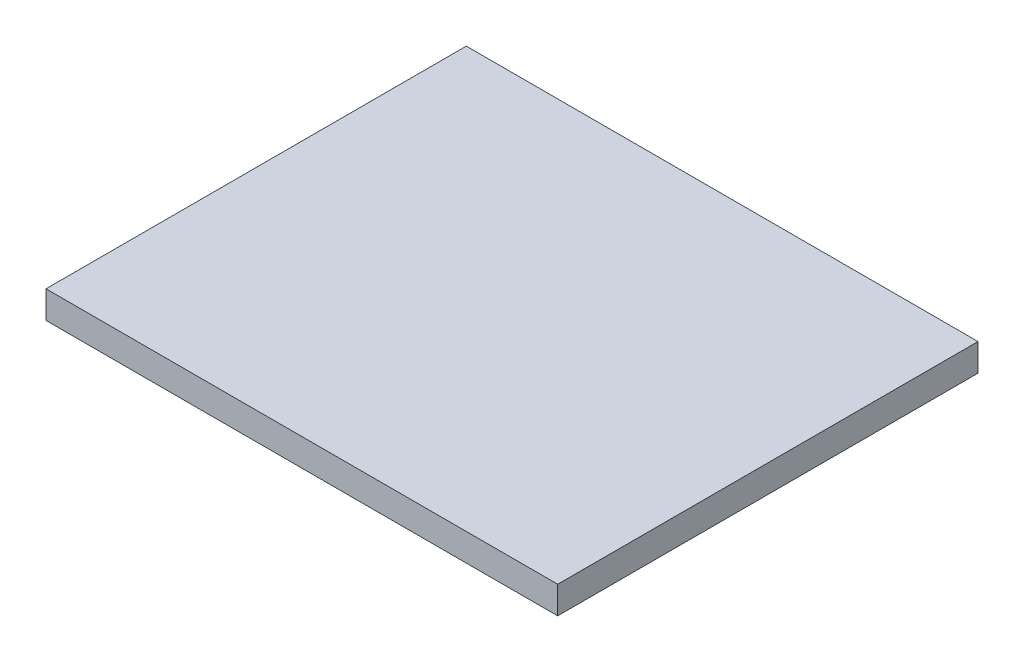
ISO-10303-21;
HEADER;
FILE_DESCRIPTION(('STEP AP214'),'2;1');
FILE_NAME('part.step','',(''),(''),'','','');
FILE_SCHEMA(('AUTOMOTIVE_DESIGN { 1 0 10303 214 1 1 1 1 }'));
ENDSEC;
DATA;
#1=APPLICATION_CONTEXT('core data for automotive mechanical design processes');
#2=APPLICATION_PROTOCOL_DEFINITION('international standard','automotive_design',2000,#1);
#3=PRODUCT_CONTEXT('',#1,'mechanical');
#4=PRODUCT('Part','Part','',(#3));
#5=PRODUCT_RELATED_PRODUCT_CATEGORY('part','',(#4));
#6=PRODUCT_DEFINITION_FORMATION('','',#4);
#7=PRODUCT_DEFINITION_CONTEXT('part definition',#1,'design');
#8=PRODUCT_DEFINITION('design','',#6,#7);
#9=PRODUCT_DEFINITION_SHAPE('','',#8);
#10=(LENGTH_UNIT() NAMED_UNIT(*) SI_UNIT(.MILLI.,.METRE.));
#11=(NAMED_UNIT(*) PLANE_ANGLE_UNIT() SI_UNIT($,.RADIAN.));
#12=(NAMED_UNIT(*) SI_UNIT($,.STERADIAN.) SOLID_ANGLE_UNIT());
#13=UNCERTAINTY_MEASURE_WITH_UNIT(LENGTH_MEASURE(1.E-05),#10,'distance_accuracy_value','');
#14=(GEOMETRIC_REPRESENTATION_CONTEXT(3) GLOBAL_UNCERTAINTY_ASSIGNED_CONTEXT((#13)) GLOBAL_UNIT_ASSIGNED_CONTEXT((#10,
#11,#12)) REPRESENTATION_CONTEXT('',''));
#15=CARTESIAN_POINT('',(0.,0.,0.));
#16=DIRECTION('',(0.,0.,1.));
#17=DIRECTION('',(1.,0.,0.));
#18=AXIS2_PLACEMENT_3D('',#15,#16,#17);
#19=CARTESIAN_POINT('',(0.,0.15,0.));
#20=DIRECTION('',(0.,1.,0.));
#21=DIRECTION('',(0.,0.,1.));
#22=AXIS2_PLACEMENT_3D('',#19,#20,#21);
#23=PLANE('',#22);
#24=DIRECTION('',(-1.,0.,0.));
#25=VECTOR('',#24,1.);
#26=CARTESIAN_POINT('',(1.4,0.15,-1.15));
#27=LINE('',#26,#25);
#28=CARTESIAN_POINT('',(-1.4,0.15,-1.15));
#29=VERTEX_POINT('',#28);
#30=CARTESIAN_POINT('',(1.4,0.15,-1.15));
#31=VERTEX_POINT('',#30);
#32=EDGE_CURVE('E68',#29,#31,#27,.F.);
#33=ORIENTED_EDGE('',*,*,#32,.F.);
#34=DIRECTION('',(0.,0.,1.));
#35=VECTOR('',#34,1.);
#36=CARTESIAN_POINT('',(-1.4,0.15,-1.15));
#37=LINE('',#36,#35);
#38=CARTESIAN_POINT('',(-1.4,0.15,1.15));
#39=VERTEX_POINT('',#38);
#40=EDGE_CURVE('E20',#39,#29,#37,.F.);
#41=ORIENTED_EDGE('',*,*,#40,.F.);
#42=DIRECTION('',(1.,0.,0.));
#43=VECTOR('',#42,1.);
#44=CARTESIAN_POINT('',(-1.4,0.15,1.15));
#45=LINE('',#44,#43);
#46=CARTESIAN_POINT('',(1.4,0.15,1.15));
#47=VERTEX_POINT('',#46);
#48=EDGE_CURVE('E58',#47,#39,#45,.F.);
#49=ORIENTED_EDGE('',*,*,#48,.F.);
#50=DIRECTION('',(0.,0.,-1.));
#51=VECTOR('',#50,1.);
#52=CARTESIAN_POINT('',(1.4,0.15,1.15));
#53=LINE('',#52,#51);
#54=EDGE_CURVE('E53',#31,#47,#53,.F.);
#55=ORIENTED_EDGE('',*,*,#54,.F.);
#56=EDGE_LOOP('',(#33,#41,#49,#55));
#57=FACE_BOUND('',#56,.T.);
#58=ADVANCED_FACE('F17',(#57),#23,.T.);
#59=CARTESIAN_POINT('',(-1.4,0.,-1.15));
#60=DIRECTION('',(-1.,0.,0.));
#61=DIRECTION('',(0.,0.,1.));
#62=AXIS2_PLACEMENT_3D('',#59,#60,#61);
#63=PLANE('',#62);
#64=DIRECTION('',(0.,1.,0.));
#65=VECTOR('',#64,1.);
#66=CARTESIAN_POINT('',(-1.4,0.,-1.15));
#67=LINE('',#66,#65);
#68=CARTESIAN_POINT('',(-1.4,0.,-1.15));
#69=VERTEX_POINT('',#68);
#70=EDGE_CURVE('E79',#69,#29,#67,.T.);
#71=ORIENTED_EDGE('',*,*,#70,.F.);
#72=DIRECTION('',(0.,0.,1.));
#73=VECTOR('',#72,1.);
#74=CARTESIAN_POINT('',(-1.4,0.,0.));
#75=LINE('',#74,#73);
#76=CARTESIAN_POINT('',(-1.4,0.,1.15));
#77=VERTEX_POINT('',#76);
#78=EDGE_CURVE('E74',#69,#77,#75,.T.);
#79=ORIENTED_EDGE('',*,*,#78,.T.);
#80=DIRECTION('',(0.,1.,0.));
#81=VECTOR('',#80,1.);
#82=CARTESIAN_POINT('',(-1.4,0.,1.15));
#83=LINE('',#82,#81);
#84=EDGE_CURVE('E63',#39,#77,#83,.F.);
#85=ORIENTED_EDGE('',*,*,#84,.F.);
#86=ORIENTED_EDGE('',*,*,#40,.T.);
#87=EDGE_LOOP('',(#71,#79,#85,#86));
#88=FACE_BOUND('',#87,.T.);
#89=ADVANCED_FACE('F73',(#88),#63,.T.);
#90=CARTESIAN_POINT('',(-1.4,0.,1.15));
#91=DIRECTION('',(0.,0.,1.));
#92=DIRECTION('',(1.,0.,0.));
#93=AXIS2_PLACEMENT_3D('',#90,#91,#92);
#94=PLANE('',#93);
#95=ORIENTED_EDGE('',*,*,#84,.T.);
#96=DIRECTION('',(1.,0.,0.));
#97=VECTOR('',#96,1.);
#98=CARTESIAN_POINT('',(0.,0.,1.15));
#99=LINE('',#98,#97);
#100=CARTESIAN_POINT('',(1.4,0.,1.15));
#101=VERTEX_POINT('',#100);
#102=EDGE_CURVE('E84',#77,#101,#99,.T.);
#103=ORIENTED_EDGE('',*,*,#102,.T.);
#104=DIRECTION('',(0.,1.,0.));
#105=VECTOR('',#104,1.);
#106=CARTESIAN_POINT('',(1.4,0.,1.15));
#107=LINE('',#106,#105);
#108=EDGE_CURVE('E65',#47,#101,#107,.F.);
#109=ORIENTED_EDGE('',*,*,#108,.F.);
#110=ORIENTED_EDGE('',*,*,#48,.T.);
#111=EDGE_LOOP('',(#95,#103,#109,#110));
#112=FACE_BOUND('',#111,.T.);
#113=ADVANCED_FACE('F60',(#112),#94,.T.);
#114=CARTESIAN_POINT('',(1.4,0.,1.15));
#115=DIRECTION('',(1.,0.,0.));
#116=DIRECTION('',(0.,0.,-1.));
#117=AXIS2_PLACEMENT_3D('',#114,#115,#116);
#118=PLANE('',#117);
#119=ORIENTED_EDGE('',*,*,#108,.T.);
#120=DIRECTION('',(0.,0.,1.));
#121=VECTOR('',#120,1.);
#122=CARTESIAN_POINT('',(1.4,0.,0.));
#123=LINE('',#122,#121);
#124=CARTESIAN_POINT('',(1.4,0.,-1.15));
#125=VERTEX_POINT('',#124);
#126=EDGE_CURVE('E26',#101,#125,#123,.F.);
#127=ORIENTED_EDGE('',*,*,#126,.T.);
#128=DIRECTION('',(0.,1.,0.));
#129=VECTOR('',#128,1.);
#130=CARTESIAN_POINT('',(1.4,0.,-1.15));
#131=LINE('',#130,#129);
#132=EDGE_CURVE('E34',#31,#125,#131,.F.);
#133=ORIENTED_EDGE('',*,*,#132,.F.);
#134=ORIENTED_EDGE('',*,*,#54,.T.);
#135=EDGE_LOOP('',(#119,#127,#133,#134));
#136=FACE_BOUND('',#135,.T.);
#137=ADVANCED_FACE('F88',(#136),#118,.T.);
#138=CARTESIAN_POINT('',(1.4,0.,-1.15));
#139=DIRECTION('',(0.,0.,-1.));
#140=DIRECTION('',(-1.,0.,0.));
#141=AXIS2_PLACEMENT_3D('',#138,#139,#140);
#142=PLANE('',#141);
#143=ORIENTED_EDGE('',*,*,#132,.T.);
#144=DIRECTION('',(1.,0.,0.));
#145=VECTOR('',#144,1.);
#146=CARTESIAN_POINT('',(0.,0.,-1.15));
#147=LINE('',#146,#145);
#148=EDGE_CURVE('E11',#125,#69,#147,.F.);
#149=ORIENTED_EDGE('',*,*,#148,.T.);
#150=ORIENTED_EDGE('',*,*,#70,.T.);
#151=ORIENTED_EDGE('',*,*,#32,.T.);
#152=EDGE_LOOP('',(#143,#149,#150,#151));
#153=FACE_BOUND('',#152,.T.);
#154=ADVANCED_FACE('F91',(#153),#142,.T.);
#155=CARTESIAN_POINT('',(0.,0.,0.));
#156=DIRECTION('',(0.,1.,0.));
#157=DIRECTION('',(0.,0.,1.));
#158=AXIS2_PLACEMENT_3D('',#155,#156,#157);
#159=PLANE('',#158);
#160=ORIENTED_EDGE('',*,*,#126,.F.);
#161=ORIENTED_EDGE('',*,*,#102,.F.);
#162=ORIENTED_EDGE('',*,*,#78,.F.);
#163=ORIENTED_EDGE('',*,*,#148,.F.);
#164=EDGE_LOOP('',(#160,#161,#162,#163));
#165=FACE_BOUND('',#164,.T.);
#166=ADVANCED_FACE('F90',(#165),#159,.F.);
#167=CLOSED_SHELL('',(#58,#89,#113,#137,#154,#166));
#168=MANIFOLD_SOLID_BREP('B1',#167);
#169=ADVANCED_BREP_SHAPE_REPRESENTATION('',(#18,#168),#14);
#170=SHAPE_DEFINITION_REPRESENTATION(#9,#169);
ENDSEC;
END-ISO-10303-21;
